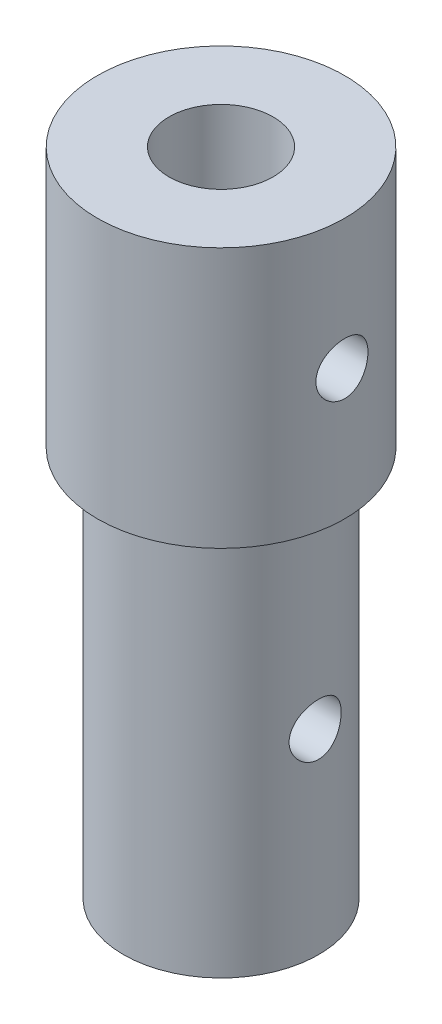
ISO-10303-21;
HEADER;
FILE_DESCRIPTION(('STEP AP214'),'2;1');
FILE_NAME('part.step','',(''),(''),'','','');
FILE_SCHEMA(('AUTOMOTIVE_DESIGN { 1 0 10303 214 1 1 1 1 }'));
ENDSEC;
DATA;
#1=APPLICATION_CONTEXT('core data for automotive mechanical design processes');
#2=APPLICATION_PROTOCOL_DEFINITION('international standard','automotive_design',2000,#1);
#3=PRODUCT_CONTEXT('',#1,'mechanical');
#4=PRODUCT('Part','Part','',(#3));
#5=PRODUCT_RELATED_PRODUCT_CATEGORY('part','',(#4));
#6=PRODUCT_DEFINITION_FORMATION('','',#4);
#7=PRODUCT_DEFINITION_CONTEXT('part definition',#1,'design');
#8=PRODUCT_DEFINITION('design','',#6,#7);
#9=PRODUCT_DEFINITION_SHAPE('','',#8);
#10=(LENGTH_UNIT() NAMED_UNIT(*) SI_UNIT(.MILLI.,.METRE.));
#11=(NAMED_UNIT(*) PLANE_ANGLE_UNIT() SI_UNIT($,.RADIAN.));
#12=(NAMED_UNIT(*) SI_UNIT($,.STERADIAN.) SOLID_ANGLE_UNIT());
#13=UNCERTAINTY_MEASURE_WITH_UNIT(LENGTH_MEASURE(1.E-05),#10,'distance_accuracy_value','');
#14=(GEOMETRIC_REPRESENTATION_CONTEXT(3) GLOBAL_UNCERTAINTY_ASSIGNED_CONTEXT((#13)) GLOBAL_UNIT_ASSIGNED_CONTEXT((#10,
#11,#12)) REPRESENTATION_CONTEXT('',''));
#15=CARTESIAN_POINT('',(0.,0.,0.));
#16=DIRECTION('',(0.,0.,1.));
#17=DIRECTION('',(1.,0.,0.));
#18=AXIS2_PLACEMENT_3D('',#15,#16,#17);
#19=CARTESIAN_POINT('',(0.,50.,0.));
#20=DIRECTION('',(0.,-1.,0.));
#21=DIRECTION('',(0.,0.,-1.));
#22=AXIS2_PLACEMENT_3D('',#19,#20,#21);
#23=CYLINDRICAL_SURFACE('',#22,9.5);
#24=CARTESIAN_POINT('',(0.,50.,0.));
#25=DIRECTION('',(0.,1.,0.));
#26=DIRECTION('',(0.,0.,1.));
#27=AXIS2_PLACEMENT_3D('',#24,#25,#26);
#28=CIRCLE('',#27,9.5);
#29=CARTESIAN_POINT('',(0.,50.,9.5));
#30=VERTEX_POINT('',#29);
#31=EDGE_CURVE('E91',#30,#30,#28,.T.);
#32=ORIENTED_EDGE('',*,*,#31,.F.);
#33=EDGE_LOOP('',(#32));
#34=FACE_BOUND('',#33,.T.);
#35=CARTESIAN_POINT('',(0.,30.,0.));
#36=DIRECTION('',(0.,1.,0.));
#37=DIRECTION('',(0.,0.,1.));
#38=AXIS2_PLACEMENT_3D('',#35,#36,#37);
#39=CIRCLE('',#38,9.5);
#40=CARTESIAN_POINT('',(0.,30.,9.5));
#41=VERTEX_POINT('',#40);
#42=EDGE_CURVE('E88',#41,#41,#39,.T.);
#43=ORIENTED_EDGE('',*,*,#42,.T.);
#44=EDGE_LOOP('',(#43));
#45=FACE_BOUND('',#44,.T.);
#46=CARTESIAN_POINT('',(9.28708781050335,40.,2.));
#47=CARTESIAN_POINT('',(9.28709004628219,39.8890030450322,1.99999604848787));
#48=CARTESIAN_POINT('',(9.28909937908883,39.7779575948162,1.99072834902824));
#49=CARTESIAN_POINT('',(9.29690617273113,39.55901720557,1.95393863409866));
#50=CARTESIAN_POINT('',(9.30270650302418,39.451124717738,1.92640279098501));
#51=CARTESIAN_POINT('',(9.31740991810553,39.2416891697061,1.85397609005222));
#52=CARTESIAN_POINT('',(9.32630974059008,39.1401395654572,1.80910347426968));
#53=CARTESIAN_POINT('',(9.34620545074923,38.9460099785549,1.70332822355249));
#54=CARTESIAN_POINT('',(9.35720126235131,38.8534296705507,1.64242617036495));
#55=CARTESIAN_POINT('',(9.38024234347676,38.6784141979561,1.50530439177798));
#56=CARTESIAN_POINT('',(9.39230019123638,38.5961399162731,1.42888140265771));
#57=CARTESIAN_POINT('',(9.4159963506712,38.4454789714635,1.26332609209004));
#58=CARTESIAN_POINT('',(9.42763463114851,38.3770933393151,1.17419282797262));
#59=CARTESIAN_POINT('',(9.44931673722958,38.2555199104585,0.984674376392207));
#60=CARTESIAN_POINT('',(9.45934399483539,38.2024860283439,0.884188396563356));
#61=CARTESIAN_POINT('',(9.47653252407335,38.1141161470699,0.675484795669489));
#62=CARTESIAN_POINT('',(9.4836940932778,38.0787783102621,0.567267978748516));
#63=CARTESIAN_POINT('',(9.49425545534837,38.0273073260764,0.347846036008974));
#64=CARTESIAN_POINT('',(9.49770848039411,38.0109021576297,0.236707324826061));
#65=CARTESIAN_POINT('',(9.50064786364403,37.9969125042003,0.0132051123854722));
#66=CARTESIAN_POINT('',(9.50013464357649,37.9993260182394,-0.0991582573863669));
#67=CARTESIAN_POINT('',(9.49524029898523,38.02270095355,-0.320047679053739));
#68=CARTESIAN_POINT('',(9.49092030201756,38.0433692593868,-0.42860630171161));
#69=CARTESIAN_POINT('',(9.47896712250148,38.1022009647552,-0.640679021827896));
#70=CARTESIAN_POINT('',(9.47133379760883,38.1403651159317,-0.744192902346074));
#71=CARTESIAN_POINT('',(9.45351224173596,38.2333699206865,-0.944061522506243));
#72=CARTESIAN_POINT('',(9.44330681774517,38.2883233476939,-1.04036218955075));
#73=CARTESIAN_POINT('',(9.42146280046143,38.4132629816543,-1.22248275831773));
#74=CARTESIAN_POINT('',(9.40982402551375,38.4832510948561,-1.3083013288483));
#75=CARTESIAN_POINT('',(9.38613072324991,38.6378747264907,-1.46876329697693));
#76=CARTESIAN_POINT('',(9.37407250702203,38.7227667919666,-1.54315914177499));
#77=CARTESIAN_POINT('',(9.35111090453841,38.9039456591447,-1.67670206801193));
#78=CARTESIAN_POINT('',(9.34020754511678,39.0002327255098,-1.7358487951699));
#79=CARTESIAN_POINT('',(9.32078149698533,39.2018484733223,-1.83731339767347));
#80=CARTESIAN_POINT('',(9.31226501615453,39.307199817267,-1.87958750888871));
#81=CARTESIAN_POINT('',(9.29866512008386,39.5237319602886,-1.94575946786074));
#82=CARTESIAN_POINT('',(9.29358120427221,39.6349119068295,-1.96965999511226));
#83=CARTESIAN_POINT('',(9.28752335798651,39.8576914785902,-1.99802865644981));
#84=CARTESIAN_POINT('',(9.28647348271892,39.9692433603849,-2.00285591352629));
#85=CARTESIAN_POINT('',(9.28839817637478,40.191558096976,-1.99391064101408));
#86=CARTESIAN_POINT('',(9.29137249065704,40.3023210012513,-1.98013928830147));
#87=CARTESIAN_POINT('',(9.30093898330961,40.5186826888527,-1.93469842503014));
#88=CARTESIAN_POINT('',(9.30749169477901,40.6243243606935,-1.90322405334428));
#89=CARTESIAN_POINT('',(9.3234415006778,40.8288348599648,-1.82348069481082));
#90=CARTESIAN_POINT('',(9.33283885062072,40.9277030780056,-1.77521019922932));
#91=CARTESIAN_POINT('',(9.35358763018115,41.1174220490499,-1.66244389822716));
#92=CARTESIAN_POINT('',(9.36496515398555,41.2081374678299,-1.59772530294085));
#93=CARTESIAN_POINT('',(9.3883222729422,41.3775518630933,-1.45419387760046));
#94=CARTESIAN_POINT('',(9.40030193698601,41.4562494604253,-1.37537943217288));
#95=CARTESIAN_POINT('',(9.42376214796691,41.6007736931092,-1.20427422366582));
#96=CARTESIAN_POINT('',(9.43523060826274,41.6663563883681,-1.11177548384634));
#97=CARTESIAN_POINT('',(9.45615945157325,41.7810510996411,-0.916864851897607));
#98=CARTESIAN_POINT('',(9.46561992441647,41.830163852505,-0.814453403517884));
#99=CARTESIAN_POINT('',(9.48141559299094,41.9101776896109,-0.603236849515159));
#100=CARTESIAN_POINT('',(9.48776967094203,41.9411890326518,-0.494474988160271));
#101=CARTESIAN_POINT('',(9.4967179724302,41.9844664639941,-0.273137493939536));
#102=CARTESIAN_POINT('',(9.49931270029477,41.9967350666994,-0.1605623747071));
#103=CARTESIAN_POINT('',(9.50043633718011,42.0020727024615,0.0628839753092458));
#104=CARTESIAN_POINT('',(9.49904261190113,41.9955070651993,0.173746249878786));
#105=CARTESIAN_POINT('',(9.49251031027347,41.9641750426688,0.392749650055911));
#106=CARTESIAN_POINT('',(9.48737179184874,41.9394089389227,0.500890817726433));
#107=CARTESIAN_POINT('',(9.47393142103355,41.8725485089234,0.711124238714222));
#108=CARTESIAN_POINT('',(9.4656383883706,41.8305024696315,0.813232448267794));
#109=CARTESIAN_POINT('',(9.4467778146525,41.7303242084538,1.00899513608219));
#110=CARTESIAN_POINT('',(9.43621007076024,41.6721905518952,1.10264885939459));
#111=CARTESIAN_POINT('',(9.41372230018547,41.5402775507757,1.28063720637341));
#112=CARTESIAN_POINT('',(9.40178163275772,41.4662392664488,1.36477733307987));
#113=CARTESIAN_POINT('',(9.37800998504356,41.3051454418216,1.519564324803));
#114=CARTESIAN_POINT('',(9.36617903164607,41.2180867955683,1.59020796110607));
#115=CARTESIAN_POINT('',(9.34380655671436,41.0321491273049,1.71682094415388));
#116=CARTESIAN_POINT('',(9.33328250045813,40.9331390186749,1.77260102752215));
#117=CARTESIAN_POINT('',(9.31493203835597,40.7269530123631,1.86664264117731));
#118=CARTESIAN_POINT('',(9.3071032767603,40.6197843460192,1.90491947935911));
#119=CARTESIAN_POINT('',(9.29652930127854,40.4270372998197,1.95576882435574));
#120=CARTESIAN_POINT('',(9.29301153387582,40.3425295613388,1.97232467609379));
#121=CARTESIAN_POINT('',(9.28828997058717,40.1720242168942,1.99444156473289));
#122=CARTESIAN_POINT('',(9.28708607769352,40.0860266735421,2.0000030625655));
#123=CARTESIAN_POINT('',(9.28708781050335,40.,2.));
#124=B_SPLINE_CURVE_WITH_KNOTS('',3,(#46,#47,#48,#49,#50,#51,#52,#53,#54,#55,#56,#57,#58,#59,
#60,#61,#62,#63,#64,#65,#66,#67,#68,#69,#70,#71,#72,#73,#74,#75,#76,#77,#78,#79,#80,#81,#82,#83,
#84,#85,#86,#87,#88,#89,#90,#91,#92,#93,#94,#95,#96,#97,#98,#99,#100,#101,#102,#103,#104,#105,
#106,#107,#108,#109,#110,#111,#112,#113,#114,#115,#116,#117,#118,#119,#120,#121,#122,#123),
.UNSPECIFIED.,.T.,.F.,(4,2,2,2,2,2,2,2,2,2,2,2,2,2,2,2,2,2,2,2,2,2,2,2,2,2,2,2,2,2,2,2,2,2,2,2,
2,2,4),(0.,0.332675720034058,0.665603538903751,0.998181995545652,1.33074838377398,
1.66798910536292,2.00525485176212,2.34579332468104,2.68629642699646,3.02184382391206,
3.3573555427809,3.68757597677536,4.01781059880938,4.35031407759778,4.68285973942978,
5.02182136111628,5.36079085714757,5.70063394463758,6.04042746201684,6.37379176148539,
6.7071349674375,7.03687380782472,7.36664227508608,7.70114062330744,8.03567732937095,
8.37595255086766,8.71621254673811,9.05437772891384,9.39249754106857,9.72410341466951,
10.0557041591458,10.3863845135479,10.7170943671025,11.0536632320287,11.3903125124891,
11.7310632155782,12.0715153340735,12.3293619162638,12.5871976881646),.UNSPECIFIED.);
#125=CARTESIAN_POINT('',(9.28708781050335,40.,2.));
#126=VERTEX_POINT('',#125);
#127=EDGE_CURVE('E60',#126,#126,#124,.T.);
#128=ORIENTED_EDGE('',*,*,#127,.F.);
#129=EDGE_LOOP('',(#128));
#130=FACE_BOUND('',#129,.T.);
#131=ADVANCED_FACE('F30',(#34,#45,#130),#23,.T.);
#132=CARTESIAN_POINT('',(0.,35.,0.));
#133=DIRECTION('',(0.,1.,0.));
#134=DIRECTION('',(0.,0.,1.));
#135=AXIS2_PLACEMENT_3D('',#132,#133,#134);
#136=CYLINDRICAL_SURFACE('',#135,4.);
#137=CARTESIAN_POINT('',(0.,35.,0.));
#138=DIRECTION('',(0.,1.,0.));
#139=DIRECTION('',(0.,0.,1.));
#140=AXIS2_PLACEMENT_3D('',#137,#138,#139);
#141=CIRCLE('',#140,4.);
#142=CARTESIAN_POINT('',(0.,35.,4.));
#143=VERTEX_POINT('',#142);
#144=EDGE_CURVE('E85',#143,#143,#141,.T.);
#145=ORIENTED_EDGE('',*,*,#144,.F.);
#146=EDGE_LOOP('',(#145));
#147=FACE_BOUND('',#146,.T.);
#148=CARTESIAN_POINT('',(0.,50.,0.));
#149=DIRECTION('',(0.,1.,0.));
#150=DIRECTION('',(0.,0.,1.));
#151=AXIS2_PLACEMENT_3D('',#148,#149,#150);
#152=CIRCLE('',#151,4.);
#153=CARTESIAN_POINT('',(0.,50.,4.));
#154=VERTEX_POINT('',#153);
#155=EDGE_CURVE('E80',#154,#154,#152,.T.);
#156=ORIENTED_EDGE('',*,*,#155,.T.);
#157=EDGE_LOOP('',(#156));
#158=FACE_BOUND('',#157,.T.);
#159=CARTESIAN_POINT('',(3.46410161513775,40.,2.));
#160=CARTESIAN_POINT('',(3.46411185715888,40.1042132054743,1.99999158748781));
#161=CARTESIAN_POINT('',(3.46887633544978,40.2085621765338,1.99179963610437));
#162=CARTESIAN_POINT('',(3.48724701669072,40.4140551772306,1.95944672580053));
#163=CARTESIAN_POINT('',(3.50087179788183,40.5151920032478,1.93525221095662));
#164=CARTESIAN_POINT('',(3.53498701490001,40.7109031564469,1.8721998159803));
#165=CARTESIAN_POINT('',(3.55544089069169,40.8055092588492,1.83341988295964));
#166=CARTESIAN_POINT('',(3.60085327291132,40.9868484504761,1.74253507245139));
#167=CARTESIAN_POINT('',(3.62581202301253,41.0735811134368,1.69042947410139));
#168=CARTESIAN_POINT('',(3.67993738819289,41.2446114431334,1.569333074538));
#169=CARTESIAN_POINT('',(3.70928127465103,41.3281182675918,1.49930407053533));
#170=CARTESIAN_POINT('',(3.76743965382121,41.4828167805706,1.34650761698202));
#171=CARTESIAN_POINT('',(3.79625387610258,41.554002326204,1.26373385204841));
#172=CARTESIAN_POINT('',(3.85242953961661,41.6867343011885,1.08097912631265));
#173=CARTESIAN_POINT('',(3.87956212851245,41.7473075354233,0.980214377887156));
#174=CARTESIAN_POINT('',(3.92701512184167,41.8502817067871,0.768314053336921));
#175=CARTESIAN_POINT('',(3.94733982363631,41.8926941123508,0.657185076311988));
#176=CARTESIAN_POINT('',(3.97760922492053,41.9550093225312,0.436089887818819));
#177=CARTESIAN_POINT('',(3.98818960442739,41.9762990526921,0.326603580968787));
#178=CARTESIAN_POINT('',(4.00015167691179,42.000332237369,0.105141257404543));
#179=CARTESIAN_POINT('',(4.00153893568935,42.0030869135963,-0.00683321168520525));
#180=CARTESIAN_POINT('',(3.99525963833124,41.9905066520549,-0.21966504884957));
#181=CARTESIAN_POINT('',(3.98836991784381,41.9767239689564,-0.320642398354136));
#182=CARTESIAN_POINT('',(3.96748490519435,41.9342383121919,-0.518627543836086));
#183=CARTESIAN_POINT('',(3.95348908132771,41.9055342220479,-0.615635042187699));
#184=CARTESIAN_POINT('',(3.91943166575325,41.8338348678201,-0.804618783139257));
#185=CARTESIAN_POINT('',(3.89928883058403,41.7906473736558,-0.896506847030395));
#186=CARTESIAN_POINT('',(3.8547529197337,41.6914731675971,-1.07195360302661));
#187=CARTESIAN_POINT('',(3.83035832314967,41.6354818733953,-1.15550929767728));
#188=CARTESIAN_POINT('',(3.7768878879846,41.5062092969339,-1.3203473217964));
#189=CARTESIAN_POINT('',(3.74758751996351,41.431793943348,-1.40066815005872));
#190=CARTESIAN_POINT('',(3.68908681173623,41.2708205501397,-1.54820874059556));
#191=CARTESIAN_POINT('',(3.65988656531257,41.1842532554519,-1.61541842314846));
#192=CARTESIAN_POINT('',(3.60288312184969,40.9947036151518,-1.73901066928443));
#193=CARTESIAN_POINT('',(3.57528639981415,40.8910279538916,-1.7944346299561));
#194=CARTESIAN_POINT('',(3.52750900557152,40.674124657282,-1.88663822600246));
#195=CARTESIAN_POINT('',(3.50732060092135,40.5609071339649,-1.92343731642178));
#196=CARTESIAN_POINT('',(3.47889271634069,40.3375709774344,-1.97436042205008));
#197=CARTESIAN_POINT('',(3.46983311696993,40.2279177619129,-1.99005024423995));
#198=CARTESIAN_POINT('',(3.46235838723219,40.0071973169669,-2.00303389322285));
#199=CARTESIAN_POINT('',(3.46393573778623,39.8961311417604,-2.00034071463006));
#200=CARTESIAN_POINT('',(3.4766867308117,39.6886921628426,-1.97807208668793));
#201=CARTESIAN_POINT('',(3.48679175013308,39.5920410977842,-1.96037563342492));
#202=CARTESIAN_POINT('',(3.51388043102682,39.403264427458,-1.91139256926489));
#203=CARTESIAN_POINT('',(3.53086632010068,39.3111402985065,-1.88010155724727));
#204=CARTESIAN_POINT('',(3.57072444159313,39.1291773381949,-1.80329517720973));
#205=CARTESIAN_POINT('',(3.59383286486126,39.039641966294,-1.7571881273853));
#206=CARTESIAN_POINT('',(3.643122389945,38.869061456921,-1.65257412803176));
#207=CARTESIAN_POINT('',(3.66930506710298,38.7880207129695,-1.59406080866499));
#208=CARTESIAN_POINT('',(3.72575996912669,38.6260424649573,-1.45767433439709));
#209=CARTESIAN_POINT('',(3.75613166308566,38.5464056985822,-1.37829054462748));
#210=CARTESIAN_POINT('',(3.81468469955797,38.4011755239953,-1.20680899079903));
#211=CARTESIAN_POINT('',(3.84286530015463,38.3355868594732,-1.11470694931991));
#212=CARTESIAN_POINT('',(3.89482723381867,38.2188525481673,-0.917070725108062));
#213=CARTESIAN_POINT('',(3.91847283343884,38.1681337638332,-0.811246195112498));
#214=CARTESIAN_POINT('',(3.95766709918776,38.0857241920304,-0.591044729317868));
#215=CARTESIAN_POINT('',(3.97322287353397,38.0540166963159,-0.476675402917657));
#216=CARTESIAN_POINT('',(3.99335016363174,38.0132628725149,-0.253959364539768));
#217=CARTESIAN_POINT('',(3.9987985581427,38.0024042513357,-0.146022887268304));
#218=CARTESIAN_POINT('',(4.00084260752374,37.9983134660043,0.0702519714699423));
#219=CARTESIAN_POINT('',(3.99744136141634,38.0050751314711,0.178590198981611));
#220=CARTESIAN_POINT('',(3.98267937668509,38.0348328243164,0.385075986136856));
#221=CARTESIAN_POINT('',(3.97185789309443,38.056729737309,0.483424641057416));
#222=CARTESIAN_POINT('',(3.94384187353387,38.1146539598067,0.674891898931563));
#223=CARTESIAN_POINT('',(3.92664642364424,38.1506832957069,0.76800974966977));
#224=CARTESIAN_POINT('',(3.8865186139318,38.2374542549914,0.950846833596741));
#225=CARTESIAN_POINT('',(3.86337234005404,38.2887592197519,1.0402503657229));
#226=CARTESIAN_POINT('',(3.81376266676027,38.4039152881181,1.20954920326828));
#227=CARTESIAN_POINT('',(3.78729774583427,38.4677721541016,1.28944011444319));
#228=CARTESIAN_POINT('',(3.73057218840582,38.6135966355594,1.44582833859495));
#229=CARTESIAN_POINT('',(3.70019591726075,38.6967341808003,1.52119665879199));
#230=CARTESIAN_POINT('',(3.64126158628571,38.8748922283061,1.65732528394006));
#231=CARTESIAN_POINT('',(3.61270515130784,38.9699231313605,1.71807266521244));
#232=CARTESIAN_POINT('',(3.55999186256751,39.1733088941302,1.82486714716811));
#233=CARTESIAN_POINT('',(3.53600256268535,39.2819899107353,1.87038902381914));
#234=CARTESIAN_POINT('',(3.5069621813237,39.4505781196309,1.92395929504801));
#235=CARTESIAN_POINT('',(3.49844389329401,39.5076478205907,1.93935666147967));
#236=CARTESIAN_POINT('',(3.48406059323535,39.6232325575002,1.96508069805043));
#237=CARTESIAN_POINT('',(3.47819372636051,39.6817465527542,1.97541091343282));
#238=CARTESIAN_POINT('',(3.47059023668758,39.7836007892473,1.9887293296122));
#239=CARTESIAN_POINT('',(3.46816389731815,39.8267330572501,1.99295091983786));
#240=CARTESIAN_POINT('',(3.46491740045177,39.9132356930929,1.99858810035606));
#241=CARTESIAN_POINT('',(3.46409735040492,39.9566060766667,2.00000350293331));
#242=CARTESIAN_POINT('',(3.46410161513775,40.,2.));
#243=B_SPLINE_CURVE_WITH_KNOTS('',3,(#159,#160,#161,#162,#163,#164,#165,#166,#167,#168,#169,
#170,#171,#172,#173,#174,#175,#176,#177,#178,#179,#180,#181,#182,#183,#184,#185,#186,#187,#188,
#189,#190,#191,#192,#193,#194,#195,#196,#197,#198,#199,#200,#201,#202,#203,#204,#205,#206,#207,
#208,#209,#210,#211,#212,#213,#214,#215,#216,#217,#218,#219,#220,#221,#222,#223,#224,#225,#226,
#227,#228,#229,#230,#231,#232,#233,#234,#235,#236,#237,#238,#239,#240,#241,#242),.UNSPECIFIED.,
.T.,.F.,(4,2,2,2,2,2,2,2,2,2,2,2,2,2,2,2,2,2,2,2,2,2,2,2,2,2,2,2,2,2,2,2,2,2,2,2,2,2,2,2,2,4),
(0.,0.312464245189433,0.62558578564961,0.937057191861532,1.24854545093096,1.58572462503714,
1.92307142172808,2.28315784481593,2.64301653931848,2.97726969939937,3.31132047376146,
3.61632194973143,3.92134625038977,4.2305906946636,4.53994598704611,4.87854382917848,
5.21740096495904,5.57777683462964,5.93777548427477,6.2692458171249,6.60048186380813,
6.89548366852118,7.19058104876193,7.49934592816242,7.80826972444162,8.15613487165293,
8.50411729960471,8.86128362829998,9.2181355962161,9.5422454078304,9.8662417359201,
10.1688884974705,10.4715786702809,10.7872150144301,11.1029966020551,11.450204837042,
11.7977188569438,12.1562149808128,12.3351395323571,12.5139387197526,12.6440387634036,
12.7741475095882),.UNSPECIFIED.);
#244=CARTESIAN_POINT('',(3.46410161513775,40.,2.));
#245=VERTEX_POINT('',#244);
#246=EDGE_CURVE('E35',#245,#245,#243,.T.);
#247=ORIENTED_EDGE('',*,*,#246,.F.);
#248=EDGE_LOOP('',(#247));
#249=FACE_BOUND('',#248,.T.);
#250=ADVANCED_FACE('F116',(#147,#158,#249),#136,.F.);
#251=CARTESIAN_POINT('',(0.,22.,0.));
#252=DIRECTION('',(0.,-1.,0.));
#253=DIRECTION('',(0.,0.,-1.));
#254=AXIS2_PLACEMENT_3D('',#251,#252,#253);
#255=CYLINDRICAL_SURFACE('',#254,7.5);
#256=CARTESIAN_POINT('',(0.,0.,0.));
#257=DIRECTION('',(0.,1.,0.));
#258=DIRECTION('',(0.,0.,1.));
#259=AXIS2_PLACEMENT_3D('',#256,#257,#258);
#260=CIRCLE('',#259,7.5);
#261=CARTESIAN_POINT('',(0.,0.,7.5));
#262=VERTEX_POINT('',#261);
#263=EDGE_CURVE('E10',#262,#262,#260,.T.);
#264=ORIENTED_EDGE('',*,*,#263,.T.);
#265=EDGE_LOOP('',(#264));
#266=FACE_BOUND('',#265,.T.);
#267=CARTESIAN_POINT('',(0.,30.,0.));
#268=DIRECTION('',(0.,1.,0.));
#269=DIRECTION('',(0.,0.,1.));
#270=AXIS2_PLACEMENT_3D('',#267,#268,#269);
#271=CIRCLE('',#270,7.5);
#272=CARTESIAN_POINT('',(0.,30.,7.5));
#273=VERTEX_POINT('',#272);
#274=EDGE_CURVE('E94',#273,#273,#271,.T.);
#275=ORIENTED_EDGE('',*,*,#274,.F.);
#276=EDGE_LOOP('',(#275));
#277=FACE_BOUND('',#276,.T.);
#278=CARTESIAN_POINT('',(7.22841614740048,15.,2.));
#279=CARTESIAN_POINT('',(7.22841805697252,14.8898240622597,1.99999734315871));
#280=CARTESIAN_POINT('',(7.23096264549673,14.779619999524,1.99086493224742));
#281=CARTESIAN_POINT('',(7.24083561155097,14.5623945784436,1.95464583260237));
#282=CARTESIAN_POINT('',(7.24816638907934,14.4553748450219,1.92755013620953));
#283=CARTESIAN_POINT('',(7.26672375176839,14.2476919300532,1.85635845560073));
#284=CARTESIAN_POINT('',(7.27794485684204,14.1470200411716,1.81228637542178));
#285=CARTESIAN_POINT('',(7.30301154920401,13.9544832599402,1.70846784563703));
#286=CARTESIAN_POINT('',(7.31685734034424,13.862619052493,1.6487201784145));
#287=CARTESIAN_POINT('',(7.34600139553467,13.6880074530123,1.51364847874559));
#288=CARTESIAN_POINT('',(7.36132541116443,13.6055129825355,1.43800297504208));
#289=CARTESIAN_POINT('',(7.39147701436507,13.4542184230488,1.27397427284021));
#290=CARTESIAN_POINT('',(7.40630455033439,13.3854197538582,1.18558975534664));
#291=CARTESIAN_POINT('',(7.43407988468418,13.2624150615971,0.996838170873271));
#292=CARTESIAN_POINT('',(7.44699376262293,13.2084604813671,0.896301819879481));
#293=CARTESIAN_POINT('',(7.46919126211834,13.1183153646327,0.687183044729092));
#294=CARTESIAN_POINT('',(7.47847549576262,13.0821218327184,0.578601980875105));
#295=CARTESIAN_POINT('',(7.49218553576461,13.0293447797642,0.359115961810091));
#296=CARTESIAN_POINT('',(7.49671776750265,13.0123310233741,0.248321224200917));
#297=CARTESIAN_POINT('',(7.50078524617749,12.9970428798928,0.0253635535085766));
#298=CARTESIAN_POINT('',(7.50032132946608,12.9987653563699,-0.0867991474385288));
#299=CARTESIAN_POINT('',(7.49452675859765,13.0205978125395,-0.306314237111345));
#300=CARTESIAN_POINT('',(7.48931914026999,13.0402429576363,-0.413716600721109));
#301=CARTESIAN_POINT('',(7.4747674859047,13.0966121377819,-0.623641315571054));
#302=CARTESIAN_POINT('',(7.46542321400589,13.133337146686,-0.726163388180579));
#303=CARTESIAN_POINT('',(7.44346569099892,13.2231798475924,-0.924603945147552));
#304=CARTESIAN_POINT('',(7.43082087877672,13.2764568071007,-1.02044668632954));
#305=CARTESIAN_POINT('',(7.40362468509504,13.3977688195091,-1.20198999876451));
#306=CARTESIAN_POINT('',(7.38907293223,13.4658067490282,-1.28768858808586));
#307=CARTESIAN_POINT('',(7.35911272938719,13.6171768579339,-1.44928536946561));
#308=CARTESIAN_POINT('',(7.34369169368738,13.7009144450494,-1.52480192017773));
#309=CARTESIAN_POINT('',(7.31413405023521,13.8800246762388,-1.6608133210477));
#310=CARTESIAN_POINT('',(7.29999752083065,13.9753980292004,-1.72130725529808));
#311=CARTESIAN_POINT('',(7.27455902280777,14.1759001018213,-1.82584679186274));
#312=CARTESIAN_POINT('',(7.26327507092156,14.2810853509132,-1.86978866600526));
#313=CARTESIAN_POINT('',(7.24504325087515,14.497726499455,-1.93924001685674));
#314=CARTESIAN_POINT('',(7.23809430746845,14.6091808364503,-1.96475406461341));
#315=CARTESIAN_POINT('',(7.22954835612976,14.8316272110284,-1.99596757092855));
#316=CARTESIAN_POINT('',(7.22779763213457,14.9425335486213,-2.00223632621177));
#317=CARTESIAN_POINT('',(7.22942578390815,15.1638097728085,-1.9963498112297));
#318=CARTESIAN_POINT('',(7.23280411376438,15.2741797152399,-1.98419650172323));
#319=CARTESIAN_POINT('',(7.24416124318865,15.4890565940915,-1.94231271869971));
#320=CARTESIAN_POINT('',(7.25205039699299,15.5936354379372,-1.91292447912922));
#321=CARTESIAN_POINT('',(7.27145268952784,15.7963796313599,-1.83778986725474));
#322=CARTESIAN_POINT('',(7.28296630148563,15.8945441414274,-1.79204135876651));
#323=CARTESIAN_POINT('',(7.30863572472984,16.0840549574352,-1.68432905508707));
#324=CARTESIAN_POINT('',(7.32284404872864,16.1752039758897,-1.62203095237924));
#325=CARTESIAN_POINT('',(7.35217841933666,16.3459633017032,-1.48340227987515));
#326=CARTESIAN_POINT('',(7.36730463810238,16.4255714349542,-1.40706907222966));
#327=CARTESIAN_POINT('',(7.39729964884456,16.5733524732499,-1.23990378250484));
#328=CARTESIAN_POINT('',(7.41214836523849,16.6411283769786,-1.14871641600885));
#329=CARTESIAN_POINT('',(7.43946670017127,16.7604109874105,-0.955928435940744));
#330=CARTESIAN_POINT('',(7.45193644532905,16.8119185600789,-0.854328377018885));
#331=CARTESIAN_POINT('',(7.47301150899261,16.8967296323615,-0.644314134825874));
#332=CARTESIAN_POINT('',(7.48164558480385,16.9301690194435,-0.535957852882339));
#333=CARTESIAN_POINT('',(7.49420303787247,16.9782887280644,-0.314899384731322));
#334=CARTESIAN_POINT('',(7.4981274590498,16.9929732067747,-0.202198167320245));
#335=CARTESIAN_POINT('',(7.50077413437691,17.0029058237414,0.0206420013461475));
#336=CARTESIAN_POINT('',(7.49965226288082,16.9987363191312,0.130753511527862));
#337=CARTESIAN_POINT('',(7.4926849097886,16.9724315064248,0.348648304630716));
#338=CARTESIAN_POINT('',(7.48683960554786,16.950296872883,0.456431674812813));
#339=CARTESIAN_POINT('',(7.47111310390923,16.8890193950814,0.665910123464209));
#340=CARTESIAN_POINT('',(7.46125997189229,16.8499947065276,0.767642011851539));
#341=CARTESIAN_POINT('',(7.43854816516494,16.7561503982538,0.963172098471352));
#342=CARTESIAN_POINT('',(7.42568906899253,16.7013285633872,1.05696918166215));
#343=CARTESIAN_POINT('',(7.39791331224121,16.575741727863,1.23667826867367));
#344=CARTESIAN_POINT('',(7.38295093371635,16.5045906193013,1.32231336173331));
#345=CARTESIAN_POINT('',(7.35284000077256,16.3490972506351,1.48062537156133));
#346=CARTESIAN_POINT('',(7.33769139839721,16.2647515241806,1.55329887243048));
#347=CARTESIAN_POINT('',(7.30853959638856,16.0830316041824,1.68520700232561));
#348=CARTESIAN_POINT('',(7.29456891224646,15.9854116863428,1.74411094261233));
#349=CARTESIAN_POINT('',(7.26981393903472,15.7812936891398,1.84458689030054));
#350=CARTESIAN_POINT('',(7.25902756724947,15.6748014714605,1.88617023367332));
#351=CARTESIAN_POINT('',(7.24336000653874,15.4739186639487,1.94538124252481));
#352=CARTESIAN_POINT('',(7.23780140272195,15.3803987354433,1.96581518399489));
#353=CARTESIAN_POINT('',(7.2303288521157,15.191259442006,1.9931249429388));
#354=CARTESIAN_POINT('',(7.22841448976016,15.0956403177112,2.0000023063216));
#355=CARTESIAN_POINT('',(7.22841614740048,15.,2.));
#356=B_SPLINE_CURVE_WITH_KNOTS('',3,(#278,#279,#280,#281,#282,#283,#284,#285,#286,#287,#288,
#289,#290,#291,#292,#293,#294,#295,#296,#297,#298,#299,#300,#301,#302,#303,#304,#305,#306,#307,
#308,#309,#310,#311,#312,#313,#314,#315,#316,#317,#318,#319,#320,#321,#322,#323,#324,#325,#326,
#327,#328,#329,#330,#331,#332,#333,#334,#335,#336,#337,#338,#339,#340,#341,#342,#343,#344,#345,
#346,#347,#348,#349,#350,#351,#352,#353,#354,#355),.UNSPECIFIED.,.T.,.F.,(4,2,2,2,2,2,2,2,2,2,2,
2,2,2,2,2,2,2,2,2,2,2,2,2,2,2,2,2,2,2,2,2,2,2,2,2,2,2,4),(0.,0.330176128116025,0.6605179478502,
0.990396311596168,1.32030030656105,1.65765916130211,1.99505297124461,2.33785207370803,
2.68059334304246,3.0154830431648,3.35031668385603,3.67670570800803,4.00311334440695,
4.3327644890557,4.66247993394491,5.00231762300329,5.34217602639579,5.68413015096536,
6.02599942418507,6.35765334242023,6.68927196343503,7.01451850432574,7.33980752864823,
7.67224634967772,8.00474771541474,8.34685906959633,8.68895221008103,9.028435395914,
9.36784331959005,9.69684054916462,10.0258254261296,10.3525451486866,10.6793107076596,
11.0147885399158,11.3503546538105,11.6933003898558,12.0360213210131,12.3226696767153,
12.6092853429065),.UNSPECIFIED.);
#357=CARTESIAN_POINT('',(7.22841614740048,15.,2.));
#358=VERTEX_POINT('',#357);
#359=EDGE_CURVE('E59',#358,#358,#356,.T.);
#360=ORIENTED_EDGE('',*,*,#359,.F.);
#361=EDGE_LOOP('',(#360));
#362=FACE_BOUND('',#361,.T.);
#363=ADVANCED_FACE('F32',(#266,#277,#362),#255,.T.);
#364=CARTESIAN_POINT('',(0.,22.,0.));
#365=DIRECTION('',(0.,-1.,0.));
#366=DIRECTION('',(0.,0.,-1.));
#367=AXIS2_PLACEMENT_3D('',#364,#365,#366);
#368=CYLINDRICAL_SURFACE('',#367,2.5);
#369=CARTESIAN_POINT('',(0.,0.,0.));
#370=DIRECTION('',(0.,1.,0.));
#371=DIRECTION('',(0.,0.,1.));
#372=AXIS2_PLACEMENT_3D('',#369,#370,#371);
#373=CIRCLE('',#372,2.5);
#374=CARTESIAN_POINT('',(0.,0.,2.5));
#375=VERTEX_POINT('',#374);
#376=EDGE_CURVE('E44',#375,#375,#373,.T.);
#377=ORIENTED_EDGE('',*,*,#376,.F.);
#378=EDGE_LOOP('',(#377));
#379=FACE_BOUND('',#378,.T.);
#380=CARTESIAN_POINT('',(0.,22.,0.));
#381=DIRECTION('',(0.,1.,0.));
#382=DIRECTION('',(0.,0.,1.));
#383=AXIS2_PLACEMENT_3D('',#380,#381,#382);
#384=CIRCLE('',#383,2.5);
#385=CARTESIAN_POINT('',(0.,22.,2.5));
#386=VERTEX_POINT('',#385);
#387=EDGE_CURVE('E49',#386,#386,#384,.T.);
#388=ORIENTED_EDGE('',*,*,#387,.T.);
#389=EDGE_LOOP('',(#388));
#390=FACE_BOUND('',#389,.T.);
#391=CARTESIAN_POINT('',(1.5,15.,2.));
#392=CARTESIAN_POINT('',(1.5000227575991,14.9249189826114,1.9999899563842));
#393=CARTESIAN_POINT('',(1.50575588676017,14.8497210739064,1.99572243014959));
#394=CARTESIAN_POINT('',(1.52759797098302,14.7016854705704,1.97904350434638));
#395=CARTESIAN_POINT('',(1.54374252679463,14.6288567781879,1.96660415938922));
#396=CARTESIAN_POINT('',(1.59078313764401,14.4623945804914,1.9288828901246));
#397=CARTESIAN_POINT('',(1.62485949442394,14.3703574929004,1.90063587852784));
#398=CARTESIAN_POINT('',(1.70094533012843,14.1940318598387,1.83286412912235));
#399=CARTESIAN_POINT('',(1.74297705283045,14.1097660503329,1.79330760683741));
#400=CARTESIAN_POINT('',(1.84624966659378,13.9196603432195,1.68777756612173));
#401=CARTESIAN_POINT('',(1.90894188114929,13.8170334258727,1.61742363711761));
#402=CARTESIAN_POINT('',(2.03287996747903,13.6260231647878,1.4586193506474));
#403=CARTESIAN_POINT('',(2.0941269976447,13.5376280578861,1.37018407682201));
#404=CARTESIAN_POINT('',(2.1979067439451,13.3928950804225,1.19476026278806));
#405=CARTESIAN_POINT('',(2.24174680788007,13.3336737173159,1.11093376146689));
#406=CARTESIAN_POINT('',(2.32165152523267,13.2276340400337,0.932444755507564));
#407=CARTESIAN_POINT('',(2.35772824500368,13.1807964517991,0.837799422094951));
#408=CARTESIAN_POINT('',(2.41415644696378,13.1082870394193,0.655317082222549));
#409=CARTESIAN_POINT('',(2.43610736091393,13.0804174354239,0.568853585755695));
#410=CARTESIAN_POINT('',(2.47085912284979,13.036501304746,0.391188052921992));
#411=CARTESIAN_POINT('',(2.48366497483986,13.02044831209,0.299988637312623));
#412=CARTESIAN_POINT('',(2.49907968883617,13.0011419067099,0.115048335136528));
#413=CARTESIAN_POINT('',(2.50165324772141,12.9979328073114,0.0212997713727016));
#414=CARTESIAN_POINT('',(2.49626936144757,13.0046642348722,-0.165416366428141));
#415=CARTESIAN_POINT('',(2.48831142893578,13.0146053703685,-0.258383904122232));
#416=CARTESIAN_POINT('',(2.4632836571348,13.046067986313,-0.435683568436098));
#417=CARTESIAN_POINT('',(2.44673404857181,13.0669288169561,-0.520210188917498));
#418=CARTESIAN_POINT('',(2.40604493660584,13.1186952342522,-0.684171862172426));
#419=CARTESIAN_POINT('',(2.38190351809567,13.1496033554976,-0.763605624129769));
#420=CARTESIAN_POINT('',(2.32486221996811,13.2236006985885,-0.923527318234432));
#421=CARTESIAN_POINT('',(2.29134265660255,13.2675765160147,-1.00337969293305));
#422=CARTESIAN_POINT('',(2.21894043646479,13.3645378595917,-1.15470891362336));
#423=CARTESIAN_POINT('',(2.18005477975511,13.4175284293631,-1.22618103296473));
#424=CARTESIAN_POINT('',(2.09053510980241,13.5430618687988,-1.37426521356107));
#425=CARTESIAN_POINT('',(2.03913144290366,13.6173836142049,-1.44890108738507));
#426=CARTESIAN_POINT('',(1.9349237792571,13.7762559036507,-1.58538384993671));
#427=CARTESIAN_POINT('',(1.88211814269102,13.8608188786743,-1.6472149443604));
#428=CARTESIAN_POINT('',(1.78441317626436,14.0312201958179,-1.75228528490804));
#429=CARTESIAN_POINT('',(1.73924224553799,14.1161509405137,-1.79674173995946));
#430=CARTESIAN_POINT('',(1.65582105773209,14.2943664663345,-1.87389106987978));
#431=CARTESIAN_POINT('',(1.61755576516689,14.3876324203376,-1.90660965872837));
#432=CARTESIAN_POINT('',(1.56393805143324,14.5527916040277,-1.95062199735974));
#433=CARTESIAN_POINT('',(1.54515601955456,14.6226128308979,-1.96540293714784));
#434=CARTESIAN_POINT('',(1.51667304681101,14.7651802059541,-1.98746978122375));
#435=CARTESIAN_POINT('',(1.50695186390373,14.8379194539107,-1.99477239579985));
#436=CARTESIAN_POINT('',(1.49827790293909,14.9848633779274,-2.0012999442642));
#437=CARTESIAN_POINT('',(1.49938753445573,15.0590740850574,-2.00047806264257));
#438=CARTESIAN_POINT('',(1.51230456185753,15.2060473250374,-1.99072610261057));
#439=CARTESIAN_POINT('',(1.52412705251965,15.2788076663875,-1.98178458332098));
#440=CARTESIAN_POINT('',(1.56051508430773,15.4390632026618,-1.95331430449204));
#441=CARTESIAN_POINT('',(1.58755721486228,15.5255982681308,-1.9316709289088));
#442=CARTESIAN_POINT('',(1.65022809339808,15.6922908660855,-1.87841388450525));
#443=CARTESIAN_POINT('',(1.6858823654909,15.7724284809031,-1.84677049067316));
#444=CARTESIAN_POINT('',(1.77903249993889,15.9615289293493,-1.75807608919816));
#445=CARTESIAN_POINT('',(1.83905564347523,16.0668953343252,-1.69602510944931));
#446=CARTESIAN_POINT('',(1.96026853157683,16.264384149242,-1.55438039564658));
#447=CARTESIAN_POINT('',(2.02145957104429,16.3564907596835,-1.47476601547362));
#448=CARTESIAN_POINT('',(2.13993299259158,16.527462807345,-1.29702304107541));
#449=CARTESIAN_POINT('',(2.1971478825966,16.6061226291131,-1.19864860522963));
#450=CARTESIAN_POINT('',(2.30083046289374,16.7452665274442,-0.984970277741323));
#451=CARTESIAN_POINT('',(2.34733292440641,16.8058096056706,-0.869723203455195));
#452=CARTESIAN_POINT('',(2.41163161860483,16.8884905874669,-0.664531994140978));
#453=CARTESIAN_POINT('',(2.43384921549886,16.9167173769741,-0.57840826512334));
#454=CARTESIAN_POINT('',(2.46921550391513,16.961432134964,-0.401365381235638));
#455=CARTESIAN_POINT('',(2.48237111815073,16.9779290645406,-0.310449944179065));
#456=CARTESIAN_POINT('',(2.49854699723994,16.9981928241047,-0.125961358052308));
#457=CARTESIAN_POINT('',(2.50153028039159,17.0019132050583,-0.0323797561454531));
#458=CARTESIAN_POINT('',(2.4969871999336,16.9962334907348,0.15412949497155));
#459=CARTESIAN_POINT('',(2.48946009629711,16.9868324715917,0.247057097671185));
#460=CARTESIAN_POINT('',(2.46524008405095,16.9563964529088,0.424484983307843));
#461=CARTESIAN_POINT('',(2.44905900306101,16.9360106685972,0.509170159101614));
#462=CARTESIAN_POINT('',(2.4090520196301,16.8851465786865,0.673520542356745));
#463=CARTESIAN_POINT('',(2.3852241372675,16.854665659174,0.753184443303526));
#464=CARTESIAN_POINT('',(2.32886203207213,16.7816254556074,0.913383591851867));
#465=CARTESIAN_POINT('',(2.29572397002092,16.738206157889,0.99331008815397));
#466=CARTESIAN_POINT('',(2.22403396009593,16.6423576629054,1.14486396126305));
#467=CARTESIAN_POINT('',(2.18547913977516,16.5899236819315,1.21648689776308));
#468=CARTESIAN_POINT('',(2.0966685242987,16.4657037869963,1.36488223995398));
#469=CARTESIAN_POINT('',(2.04563299169992,16.3921535866846,1.43970803793641));
#470=CARTESIAN_POINT('',(1.94201312920059,16.2348830744766,1.57669353079991));
#471=CARTESIAN_POINT('',(1.88942694411833,16.1511501723947,1.63883728583053));
#472=CARTESIAN_POINT('',(1.79109125321811,15.9810424554704,1.7455126136634));
#473=CARTESIAN_POINT('',(1.74513263017547,15.8954274787839,1.79106140064659));
#474=CARTESIAN_POINT('',(1.66007449903139,15.7156081117486,1.87016304685231));
#475=CARTESIAN_POINT('',(1.6209622208173,15.6214202219623,1.90373836359645));
#476=CARTESIAN_POINT('',(1.56580101941138,15.4538606732473,1.94914139922438));
#477=CARTESIAN_POINT('',(1.54635220628733,15.3825804555928,1.96446470848963));
#478=CARTESIAN_POINT('',(1.51695472225641,15.2369757290291,1.98726282623961));
#479=CARTESIAN_POINT('',(1.50696990066825,15.1626639447221,1.99476751139893));
#480=CARTESIAN_POINT('',(1.50085460132402,15.0586747856577,1.99935742227831));
#481=CARTESIAN_POINT('',(1.49999110491774,15.0293463217565,2.00000392566845));
#482=CARTESIAN_POINT('',(1.5,15.,2.));
#483=B_SPLINE_CURVE_WITH_KNOTS('',3,(#391,#392,#393,#394,#395,#396,#397,#398,#399,#400,#401,
#402,#403,#404,#405,#406,#407,#408,#409,#410,#411,#412,#413,#414,#415,#416,#417,#418,#419,#420,
#421,#422,#423,#424,#425,#426,#427,#428,#429,#430,#431,#432,#433,#434,#435,#436,#437,#438,#439,
#440,#441,#442,#443,#444,#445,#446,#447,#448,#449,#450,#451,#452,#453,#454,#455,#456,#457,#458,
#459,#460,#461,#462,#463,#464,#465,#466,#467,#468,#469,#470,#471,#472,#473,#474,#475,#476,#477,
#478,#479,#480,#481,#482),.UNSPECIFIED.,.T.,.F.,(4,2,2,2,2,2,2,2,2,2,2,2,2,2,2,2,2,2,2,2,2,2,2,
2,2,2,2,2,2,2,2,2,2,2,2,2,2,2,2,2,2,2,2,2,2,4),(0.,0.225140818813291,0.451055593895016,
0.755714384660878,1.06123795594964,1.47720804611674,1.89283253536879,2.22639303179097,
2.55943127851024,2.83862094435178,3.11765772560939,3.39765639927928,3.67766803055209,
3.94241917501297,4.20723715914625,4.49756510688428,4.78805602626152,5.13841226546404,
5.48919811771067,5.80619193384967,6.12248701337036,6.34307726284837,6.56317352160417,
6.78453876949455,7.00621641426758,7.28428560377194,7.56318925297414,7.96975811975667,
8.3768074872857,8.78961174948153,9.20105660259844,9.47985927613151,9.75844872724252,
10.0380499218877,10.3176708039936,10.5823344198312,10.8470666181456,11.1364335884202,
11.4259545900794,11.7747351905783,12.1239515037794,12.4449574092071,12.7653580273015,
12.9909138326702,13.2156045429056,13.3036035490356),.UNSPECIFIED.);
#484=CARTESIAN_POINT('',(1.5,15.,2.));
#485=VERTEX_POINT('',#484);
#486=EDGE_CURVE('E52',#485,#485,#483,.T.);
#487=ORIENTED_EDGE('',*,*,#486,.T.);
#488=EDGE_LOOP('',(#487));
#489=FACE_BOUND('',#488,.T.);
#490=ADVANCED_FACE('F61',(#379,#390,#489),#368,.F.);
#491=CARTESIAN_POINT('',(0.,0.,0.));
#492=DIRECTION('',(0.,1.,0.));
#493=DIRECTION('',(0.,0.,1.));
#494=AXIS2_PLACEMENT_3D('',#491,#492,#493);
#495=PLANE('',#494);
#496=ORIENTED_EDGE('',*,*,#263,.F.);
#497=EDGE_LOOP('',(#496));
#498=FACE_BOUND('',#497,.T.);
#499=ORIENTED_EDGE('',*,*,#376,.T.);
#500=EDGE_LOOP('',(#499));
#501=FACE_BOUND('',#500,.T.);
#502=ADVANCED_FACE('F106',(#498,#501),#495,.F.);
#503=CARTESIAN_POINT('',(0.,22.,0.));
#504=DIRECTION('',(0.,1.,0.));
#505=DIRECTION('',(0.,0.,1.));
#506=AXIS2_PLACEMENT_3D('',#503,#504,#505);
#507=PLANE('',#506);
#508=ORIENTED_EDGE('',*,*,#387,.F.);
#509=EDGE_LOOP('',(#508));
#510=FACE_BOUND('',#509,.T.);
#511=ADVANCED_FACE('F103',(#510),#507,.F.);
#512=CARTESIAN_POINT('',(0.,50.,0.));
#513=DIRECTION('',(0.,1.,0.));
#514=DIRECTION('',(0.,0.,1.));
#515=AXIS2_PLACEMENT_3D('',#512,#513,#514);
#516=PLANE('',#515);
#517=ORIENTED_EDGE('',*,*,#155,.F.);
#518=EDGE_LOOP('',(#517));
#519=FACE_BOUND('',#518,.T.);
#520=ORIENTED_EDGE('',*,*,#31,.T.);
#521=EDGE_LOOP('',(#520));
#522=FACE_BOUND('',#521,.T.);
#523=ADVANCED_FACE('F105',(#519,#522),#516,.T.);
#524=CARTESIAN_POINT('',(0.,30.,0.));
#525=DIRECTION('',(0.,1.,0.));
#526=DIRECTION('',(0.,0.,1.));
#527=AXIS2_PLACEMENT_3D('',#524,#525,#526);
#528=PLANE('',#527);
#529=ORIENTED_EDGE('',*,*,#274,.T.);
#530=EDGE_LOOP('',(#529));
#531=FACE_BOUND('',#530,.T.);
#532=ORIENTED_EDGE('',*,*,#42,.F.);
#533=EDGE_LOOP('',(#532));
#534=FACE_BOUND('',#533,.T.);
#535=ADVANCED_FACE('F111',(#531,#534),#528,.F.);
#536=CARTESIAN_POINT('',(0.,35.,0.));
#537=DIRECTION('',(0.,1.,0.));
#538=DIRECTION('',(0.,0.,1.));
#539=AXIS2_PLACEMENT_3D('',#536,#537,#538);
#540=PLANE('',#539);
#541=ORIENTED_EDGE('',*,*,#144,.T.);
#542=EDGE_LOOP('',(#541));
#543=FACE_BOUND('',#542,.T.);
#544=ADVANCED_FACE('F69',(#543),#540,.T.);
#545=CARTESIAN_POINT('',(17.,15.,0.));
#546=DIRECTION('',(-1.,0.,0.));
#547=DIRECTION('',(0.,0.,1.));
#548=AXIS2_PLACEMENT_3D('',#545,#546,#547);
#549=CYLINDRICAL_SURFACE('',#548,2.);
#550=ORIENTED_EDGE('',*,*,#486,.F.);
#551=EDGE_LOOP('',(#550));
#552=FACE_BOUND('',#551,.T.);
#553=ORIENTED_EDGE('',*,*,#359,.T.);
#554=EDGE_LOOP('',(#553));
#555=FACE_BOUND('',#554,.T.);
#556=ADVANCED_FACE('F64',(#552,#555),#549,.F.);
#557=CARTESIAN_POINT('',(17.,40.,0.));
#558=DIRECTION('',(-1.,0.,0.));
#559=DIRECTION('',(0.,0.,1.));
#560=AXIS2_PLACEMENT_3D('',#557,#558,#559);
#561=CYLINDRICAL_SURFACE('',#560,2.);
#562=ORIENTED_EDGE('',*,*,#246,.T.);
#563=EDGE_LOOP('',(#562));
#564=FACE_BOUND('',#563,.T.);
#565=ORIENTED_EDGE('',*,*,#127,.T.);
#566=EDGE_LOOP('',(#565));
#567=FACE_BOUND('',#566,.T.);
#568=ADVANCED_FACE('F68',(#564,#567),#561,.F.);
#569=CLOSED_SHELL('',(#131,#250,#363,#490,#502,#511,#523,#535,#544,#556,#568));
#570=MANIFOLD_SOLID_BREP('B2',#569);
#571=ADVANCED_BREP_SHAPE_REPRESENTATION('',(#18,#570),#14);
#572=SHAPE_DEFINITION_REPRESENTATION(#9,#571);
ENDSEC;
END-ISO-10303-21;
